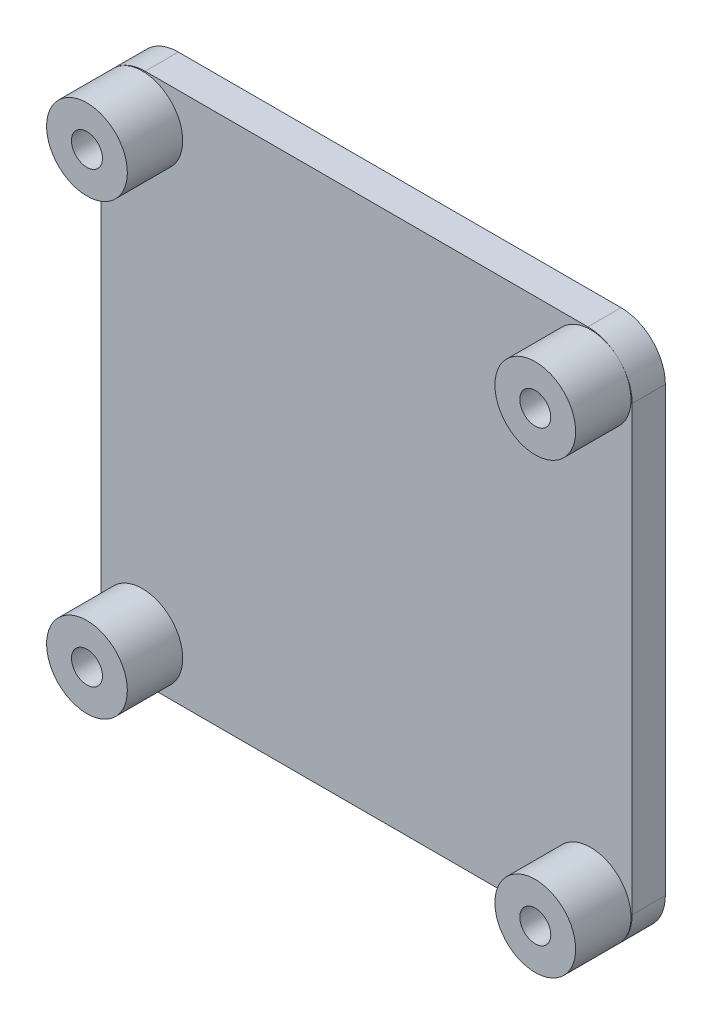
ISO-10303-21;
HEADER;
FILE_DESCRIPTION(('STEP AP214'),'2;1');
FILE_NAME('part.step','',(''),(''),'','','');
FILE_SCHEMA(('AUTOMOTIVE_DESIGN { 1 0 10303 214 1 1 1 1 }'));
ENDSEC;
DATA;
#1=APPLICATION_CONTEXT('core data for automotive mechanical design processes');
#2=APPLICATION_PROTOCOL_DEFINITION('international standard','automotive_design',2000,#1);
#3=PRODUCT_CONTEXT('',#1,'mechanical');
#4=PRODUCT('Part','Part','',(#3));
#5=PRODUCT_RELATED_PRODUCT_CATEGORY('part','',(#4));
#6=PRODUCT_DEFINITION_FORMATION('','',#4);
#7=PRODUCT_DEFINITION_CONTEXT('part definition',#1,'design');
#8=PRODUCT_DEFINITION('design','',#6,#7);
#9=PRODUCT_DEFINITION_SHAPE('','',#8);
#10=(LENGTH_UNIT() NAMED_UNIT(*) SI_UNIT(.MILLI.,.METRE.));
#11=(NAMED_UNIT(*) PLANE_ANGLE_UNIT() SI_UNIT($,.RADIAN.));
#12=(NAMED_UNIT(*) SI_UNIT($,.STERADIAN.) SOLID_ANGLE_UNIT());
#13=UNCERTAINTY_MEASURE_WITH_UNIT(LENGTH_MEASURE(1.E-05),#10,'distance_accuracy_value','');
#14=(GEOMETRIC_REPRESENTATION_CONTEXT(3) GLOBAL_UNCERTAINTY_ASSIGNED_CONTEXT((#13)) GLOBAL_UNIT_ASSIGNED_CONTEXT((#10,
#11,#12)) REPRESENTATION_CONTEXT('',''));
#15=CARTESIAN_POINT('',(0.,0.,0.));
#16=DIRECTION('',(0.,0.,1.));
#17=DIRECTION('',(1.,0.,0.));
#18=AXIS2_PLACEMENT_3D('',#15,#16,#17);
#19=CARTESIAN_POINT('',(0.,0.,3.));
#20=DIRECTION('',(0.,0.,1.));
#21=DIRECTION('',(1.,0.,0.));
#22=AXIS2_PLACEMENT_3D('',#19,#20,#21);
#23=PLANE('',#22);
#24=CARTESIAN_POINT('',(-20.,-20.,3.));
#25=DIRECTION('',(0.,0.,1.));
#26=DIRECTION('',(1.,0.,0.));
#27=AXIS2_PLACEMENT_3D('',#24,#25,#26);
#28=CIRCLE('',#27,4.);
#29=CARTESIAN_POINT('',(-24.,-20.,3.));
#30=VERTEX_POINT('',#29);
#31=CARTESIAN_POINT('',(-22.8284271247487,-22.8284271247437,3.));
#32=VERTEX_POINT('',#31);
#33=EDGE_CURVE('E275',#30,#32,#28,.T.);
#34=ORIENTED_EDGE('',*,*,#33,.T.);
#35=CARTESIAN_POINT('',(-20.2500000000002,-20.2499999999998,3.));
#36=DIRECTION('',(0.,0.,1.));
#37=DIRECTION('',(1.,0.,0.));
#38=AXIS2_PLACEMENT_3D('',#35,#36,#37);
#39=CIRCLE('',#38,3.64644660940673);
#40=EDGE_CURVE('E59',#32,#32,#39,.T.);
#41=ORIENTED_EDGE('',*,*,#40,.F.);
#42=CARTESIAN_POINT('',(-20.,-24.,3.));
#43=VERTEX_POINT('',#42);
#44=EDGE_CURVE('E274',#32,#43,#28,.T.);
#45=ORIENTED_EDGE('',*,*,#44,.T.);
#46=DIRECTION('',(1.,0.,0.));
#47=VECTOR('',#46,1.);
#48=CARTESIAN_POINT('',(-24.,-24.,3.));
#49=LINE('',#48,#47);
#50=CARTESIAN_POINT('',(20.,-24.,3.));
#51=VERTEX_POINT('',#50);
#52=EDGE_CURVE('E231',#43,#51,#49,.T.);
#53=ORIENTED_EDGE('',*,*,#52,.T.);
#54=CARTESIAN_POINT('',(20.,-20.,3.));
#55=DIRECTION('',(0.,0.,1.));
#56=DIRECTION('',(1.,0.,0.));
#57=AXIS2_PLACEMENT_3D('',#54,#55,#56);
#58=CIRCLE('',#57,4.);
#59=CARTESIAN_POINT('',(22.8284271247445,-22.8284271247479,3.));
#60=VERTEX_POINT('',#59);
#61=EDGE_CURVE('E148',#51,#60,#58,.T.);
#62=ORIENTED_EDGE('',*,*,#61,.T.);
#63=CARTESIAN_POINT('',(20.2499999999998,-20.2500000000002,3.));
#64=DIRECTION('',(0.,0.,1.));
#65=DIRECTION('',(1.,0.,0.));
#66=AXIS2_PLACEMENT_3D('',#63,#64,#65);
#67=CIRCLE('',#66,3.64644660940673);
#68=EDGE_CURVE('E64',#60,#60,#67,.T.);
#69=ORIENTED_EDGE('',*,*,#68,.F.);
#70=CARTESIAN_POINT('',(24.,-20.,3.));
#71=VERTEX_POINT('',#70);
#72=EDGE_CURVE('E131',#60,#71,#58,.T.);
#73=ORIENTED_EDGE('',*,*,#72,.T.);
#74=DIRECTION('',(0.,1.,0.));
#75=VECTOR('',#74,1.);
#76=CARTESIAN_POINT('',(24.,24.,3.));
#77=LINE('',#76,#75);
#78=CARTESIAN_POINT('',(24.,20.,3.));
#79=VERTEX_POINT('',#78);
#80=EDGE_CURVE('E221',#71,#79,#77,.T.);
#81=ORIENTED_EDGE('',*,*,#80,.T.);
#82=CARTESIAN_POINT('',(20.,20.,3.));
#83=DIRECTION('',(0.,0.,1.));
#84=DIRECTION('',(1.,0.,0.));
#85=AXIS2_PLACEMENT_3D('',#82,#83,#84);
#86=CIRCLE('',#85,4.);
#87=CARTESIAN_POINT('',(22.828427124747,22.8284271247454,3.));
#88=VERTEX_POINT('',#87);
#89=EDGE_CURVE('E141',#79,#88,#86,.T.);
#90=ORIENTED_EDGE('',*,*,#89,.T.);
#91=CARTESIAN_POINT('',(20.2500000000001,20.2499999999999,3.));
#92=DIRECTION('',(0.,0.,1.));
#93=DIRECTION('',(1.,0.,0.));
#94=AXIS2_PLACEMENT_3D('',#91,#92,#93);
#95=CIRCLE('',#94,3.64644660940673);
#96=EDGE_CURVE('E192',#88,#88,#95,.T.);
#97=ORIENTED_EDGE('',*,*,#96,.F.);
#98=CARTESIAN_POINT('',(20.,24.,3.));
#99=VERTEX_POINT('',#98);
#100=EDGE_CURVE('E144',#88,#99,#86,.T.);
#101=ORIENTED_EDGE('',*,*,#100,.T.);
#102=DIRECTION('',(-1.,0.,0.));
#103=VECTOR('',#102,1.);
#104=CARTESIAN_POINT('',(-24.,24.,3.));
#105=LINE('',#104,#103);
#106=CARTESIAN_POINT('',(-20.,24.,3.));
#107=VERTEX_POINT('',#106);
#108=EDGE_CURVE('E127',#99,#107,#105,.T.);
#109=ORIENTED_EDGE('',*,*,#108,.T.);
#110=CARTESIAN_POINT('',(-20.,20.,3.));
#111=DIRECTION('',(0.,0.,1.));
#112=DIRECTION('',(1.,0.,0.));
#113=AXIS2_PLACEMENT_3D('',#110,#111,#112);
#114=CIRCLE('',#113,4.);
#115=CARTESIAN_POINT('',(-22.8284271247461,22.8284271247463,3.));
#116=VERTEX_POINT('',#115);
#117=EDGE_CURVE('E121',#107,#116,#114,.T.);
#118=ORIENTED_EDGE('',*,*,#117,.T.);
#119=CARTESIAN_POINT('',(-20.25,20.25,3.));
#120=DIRECTION('',(0.,0.,1.));
#121=DIRECTION('',(1.,0.,0.));
#122=AXIS2_PLACEMENT_3D('',#119,#120,#121);
#123=CIRCLE('',#122,3.64644660940673);
#124=EDGE_CURVE('E125',#116,#116,#123,.T.);
#125=ORIENTED_EDGE('',*,*,#124,.F.);
#126=CARTESIAN_POINT('',(-24.,20.,3.));
#127=VERTEX_POINT('',#126);
#128=EDGE_CURVE('E132',#116,#127,#114,.T.);
#129=ORIENTED_EDGE('',*,*,#128,.T.);
#130=DIRECTION('',(0.,-1.,0.));
#131=VECTOR('',#130,1.);
#132=CARTESIAN_POINT('',(-24.,24.,3.));
#133=LINE('',#132,#131);
#134=EDGE_CURVE('E228',#127,#30,#133,.T.);
#135=ORIENTED_EDGE('',*,*,#134,.T.);
#136=EDGE_LOOP('',(#34,#41,#45,#53,#62,#69,#73,#81,#90,#97,#101,#109,#118,#125,#129,#135));
#137=FACE_BOUND('',#136,.T.);
#138=ADVANCED_FACE('F43',(#137),#23,.T.);
#139=CARTESIAN_POINT('',(0.,0.,0.));
#140=DIRECTION('',(0.,0.,1.));
#141=DIRECTION('',(1.,0.,0.));
#142=AXIS2_PLACEMENT_3D('',#139,#140,#141);
#143=PLANE('',#142);
#144=DIRECTION('',(0.,1.,0.));
#145=VECTOR('',#144,1.);
#146=CARTESIAN_POINT('',(24.,24.,0.));
#147=LINE('',#146,#145);
#148=CARTESIAN_POINT('',(24.,-20.,0.));
#149=VERTEX_POINT('',#148);
#150=CARTESIAN_POINT('',(24.,20.,0.));
#151=VERTEX_POINT('',#150);
#152=EDGE_CURVE('E220',#149,#151,#147,.T.);
#153=ORIENTED_EDGE('',*,*,#152,.F.);
#154=CARTESIAN_POINT('',(20.,-20.,0.));
#155=DIRECTION('',(0.,0.,1.));
#156=DIRECTION('',(1.,0.,0.));
#157=AXIS2_PLACEMENT_3D('',#154,#155,#156);
#158=CIRCLE('',#157,4.);
#159=CARTESIAN_POINT('',(20.,-24.,0.));
#160=VERTEX_POINT('',#159);
#161=EDGE_CURVE('E265',#149,#160,#158,.F.);
#162=ORIENTED_EDGE('',*,*,#161,.T.);
#163=DIRECTION('',(1.,0.,0.));
#164=VECTOR('',#163,1.);
#165=CARTESIAN_POINT('',(-24.,-24.,0.));
#166=LINE('',#165,#164);
#167=CARTESIAN_POINT('',(-20.,-24.,0.));
#168=VERTEX_POINT('',#167);
#169=EDGE_CURVE('E225',#168,#160,#166,.T.);
#170=ORIENTED_EDGE('',*,*,#169,.F.);
#171=CARTESIAN_POINT('',(-20.,-20.,0.));
#172=DIRECTION('',(0.,0.,1.));
#173=DIRECTION('',(1.,0.,0.));
#174=AXIS2_PLACEMENT_3D('',#171,#172,#173);
#175=CIRCLE('',#174,4.);
#176=CARTESIAN_POINT('',(-24.,-20.,0.));
#177=VERTEX_POINT('',#176);
#178=EDGE_CURVE('E256',#168,#177,#175,.F.);
#179=ORIENTED_EDGE('',*,*,#178,.T.);
#180=DIRECTION('',(0.,-1.,0.));
#181=VECTOR('',#180,1.);
#182=CARTESIAN_POINT('',(-24.,24.,0.));
#183=LINE('',#182,#181);
#184=CARTESIAN_POINT('',(-24.,20.,0.));
#185=VERTEX_POINT('',#184);
#186=EDGE_CURVE('E243',#185,#177,#183,.T.);
#187=ORIENTED_EDGE('',*,*,#186,.F.);
#188=CARTESIAN_POINT('',(-20.,20.,0.));
#189=DIRECTION('',(0.,0.,1.));
#190=DIRECTION('',(1.,0.,0.));
#191=AXIS2_PLACEMENT_3D('',#188,#189,#190);
#192=CIRCLE('',#191,4.);
#193=CARTESIAN_POINT('',(-20.,24.,0.));
#194=VERTEX_POINT('',#193);
#195=EDGE_CURVE('E262',#185,#194,#192,.F.);
#196=ORIENTED_EDGE('',*,*,#195,.T.);
#197=DIRECTION('',(-1.,0.,0.));
#198=VECTOR('',#197,1.);
#199=CARTESIAN_POINT('',(-24.,24.,0.));
#200=LINE('',#199,#198);
#201=CARTESIAN_POINT('',(20.,24.,0.));
#202=VERTEX_POINT('',#201);
#203=EDGE_CURVE('E239',#202,#194,#200,.T.);
#204=ORIENTED_EDGE('',*,*,#203,.F.);
#205=CARTESIAN_POINT('',(20.,20.,0.));
#206=DIRECTION('',(0.,0.,1.));
#207=DIRECTION('',(1.,0.,0.));
#208=AXIS2_PLACEMENT_3D('',#205,#206,#207);
#209=CIRCLE('',#208,4.);
#210=EDGE_CURVE('E259',#202,#151,#209,.F.);
#211=ORIENTED_EDGE('',*,*,#210,.T.);
#212=EDGE_LOOP('',(#153,#162,#170,#179,#187,#196,#204,#211));
#213=FACE_BOUND('',#212,.T.);
#214=CARTESIAN_POINT('',(-20.25,20.25,0.));
#215=DIRECTION('',(0.,0.,1.));
#216=DIRECTION('',(1.,0.,0.));
#217=AXIS2_PLACEMENT_3D('',#214,#215,#216);
#218=CIRCLE('',#217,1.4);
#219=CARTESIAN_POINT('',(-18.85,20.25,0.));
#220=VERTEX_POINT('',#219);
#221=EDGE_CURVE('E216',#220,#220,#218,.T.);
#222=ORIENTED_EDGE('',*,*,#221,.T.);
#223=EDGE_LOOP('',(#222));
#224=FACE_BOUND('',#223,.T.);
#225=CARTESIAN_POINT('',(20.2499999999998,20.2499999999998,0.));
#226=DIRECTION('',(0.,0.,1.));
#227=DIRECTION('',(1.,0.,0.));
#228=AXIS2_PLACEMENT_3D('',#225,#226,#227);
#229=CIRCLE('',#228,1.4);
#230=CARTESIAN_POINT('',(21.6499999999998,20.2499999999998,0.));
#231=VERTEX_POINT('',#230);
#232=EDGE_CURVE('E212',#231,#231,#229,.T.);
#233=ORIENTED_EDGE('',*,*,#232,.T.);
#234=EDGE_LOOP('',(#233));
#235=FACE_BOUND('',#234,.T.);
#236=CARTESIAN_POINT('',(20.2499999999996,-20.25,0.));
#237=DIRECTION('',(0.,0.,1.));
#238=DIRECTION('',(1.,0.,0.));
#239=AXIS2_PLACEMENT_3D('',#236,#237,#238);
#240=CIRCLE('',#239,1.4);
#241=CARTESIAN_POINT('',(21.6499999999996,-20.25,0.));
#242=VERTEX_POINT('',#241);
#243=EDGE_CURVE('E208',#242,#242,#240,.T.);
#244=ORIENTED_EDGE('',*,*,#243,.T.);
#245=EDGE_LOOP('',(#244));
#246=FACE_BOUND('',#245,.T.);
#247=CARTESIAN_POINT('',(-20.2500000000002,-20.2499999999998,0.));
#248=DIRECTION('',(0.,0.,1.));
#249=DIRECTION('',(1.,0.,0.));
#250=AXIS2_PLACEMENT_3D('',#247,#248,#249);
#251=CIRCLE('',#250,1.4);
#252=CARTESIAN_POINT('',(-18.8500000000002,-20.2499999999998,0.));
#253=VERTEX_POINT('',#252);
#254=EDGE_CURVE('E202',#253,#253,#251,.T.);
#255=ORIENTED_EDGE('',*,*,#254,.T.);
#256=EDGE_LOOP('',(#255));
#257=FACE_BOUND('',#256,.T.);
#258=ADVANCED_FACE('F293',(#213,#224,#235,#246,#257),#143,.F.);
#259=CARTESIAN_POINT('',(24.,24.,3.));
#260=DIRECTION('',(-1.,0.,0.));
#261=DIRECTION('',(0.,-1.,0.));
#262=AXIS2_PLACEMENT_3D('',#259,#260,#261);
#263=PLANE('',#262);
#264=ORIENTED_EDGE('',*,*,#80,.F.);
#265=DIRECTION('',(0.,0.,-1.));
#266=VECTOR('',#265,1.);
#267=CARTESIAN_POINT('',(24.,-20.,3.));
#268=LINE('',#267,#266);
#269=EDGE_CURVE('E252',#71,#149,#268,.T.);
#270=ORIENTED_EDGE('',*,*,#269,.T.);
#271=ORIENTED_EDGE('',*,*,#152,.T.);
#272=DIRECTION('',(0.,0.,-1.));
#273=VECTOR('',#272,1.);
#274=CARTESIAN_POINT('',(24.,20.,3.));
#275=LINE('',#274,#273);
#276=EDGE_CURVE('E235',#151,#79,#275,.F.);
#277=ORIENTED_EDGE('',*,*,#276,.T.);
#278=EDGE_LOOP('',(#264,#270,#271,#277));
#279=FACE_BOUND('',#278,.T.);
#280=ADVANCED_FACE('F306',(#279),#263,.F.);
#281=CARTESIAN_POINT('',(-24.,24.,3.));
#282=DIRECTION('',(0.,-1.,0.));
#283=DIRECTION('',(0.,0.,-1.));
#284=AXIS2_PLACEMENT_3D('',#281,#282,#283);
#285=PLANE('',#284);
#286=ORIENTED_EDGE('',*,*,#203,.T.);
#287=DIRECTION('',(0.,0.,-1.));
#288=VECTOR('',#287,1.);
#289=CARTESIAN_POINT('',(-20.,24.,3.));
#290=LINE('',#289,#288);
#291=EDGE_CURVE('E11',#194,#107,#290,.F.);
#292=ORIENTED_EDGE('',*,*,#291,.T.);
#293=ORIENTED_EDGE('',*,*,#108,.F.);
#294=DIRECTION('',(0.,0.,-1.));
#295=VECTOR('',#294,1.);
#296=CARTESIAN_POINT('',(20.,24.,3.));
#297=LINE('',#296,#295);
#298=EDGE_CURVE('E53',#99,#202,#297,.T.);
#299=ORIENTED_EDGE('',*,*,#298,.T.);
#300=EDGE_LOOP('',(#286,#292,#293,#299));
#301=FACE_BOUND('',#300,.T.);
#302=ADVANCED_FACE('F298',(#301),#285,.F.);
#303=CARTESIAN_POINT('',(-24.,24.,3.));
#304=DIRECTION('',(1.,0.,0.));
#305=DIRECTION('',(0.,1.,0.));
#306=AXIS2_PLACEMENT_3D('',#303,#304,#305);
#307=PLANE('',#306);
#308=ORIENTED_EDGE('',*,*,#134,.F.);
#309=DIRECTION('',(0.,0.,-1.));
#310=VECTOR('',#309,1.);
#311=CARTESIAN_POINT('',(-24.,20.,3.));
#312=LINE('',#311,#310);
#313=EDGE_CURVE('E137',#127,#185,#312,.T.);
#314=ORIENTED_EDGE('',*,*,#313,.T.);
#315=ORIENTED_EDGE('',*,*,#186,.T.);
#316=DIRECTION('',(0.,0.,-1.));
#317=VECTOR('',#316,1.);
#318=CARTESIAN_POINT('',(-24.,-20.,3.));
#319=LINE('',#318,#317);
#320=EDGE_CURVE('E152',#177,#30,#319,.F.);
#321=ORIENTED_EDGE('',*,*,#320,.T.);
#322=EDGE_LOOP('',(#308,#314,#315,#321));
#323=FACE_BOUND('',#322,.T.);
#324=ADVANCED_FACE('F296',(#323),#307,.F.);
#325=CARTESIAN_POINT('',(-24.,-24.,3.));
#326=DIRECTION('',(0.,1.,0.));
#327=DIRECTION('',(0.,0.,1.));
#328=AXIS2_PLACEMENT_3D('',#325,#326,#327);
#329=PLANE('',#328);
#330=ORIENTED_EDGE('',*,*,#169,.T.);
#331=DIRECTION('',(0.,0.,-1.));
#332=VECTOR('',#331,1.);
#333=CARTESIAN_POINT('',(20.,-24.,3.));
#334=LINE('',#333,#332);
#335=EDGE_CURVE('E272',#160,#51,#334,.F.);
#336=ORIENTED_EDGE('',*,*,#335,.T.);
#337=ORIENTED_EDGE('',*,*,#52,.F.);
#338=DIRECTION('',(0.,0.,-1.));
#339=VECTOR('',#338,1.);
#340=CARTESIAN_POINT('',(-20.,-24.,3.));
#341=LINE('',#340,#339);
#342=EDGE_CURVE('E268',#43,#168,#341,.T.);
#343=ORIENTED_EDGE('',*,*,#342,.T.);
#344=EDGE_LOOP('',(#330,#336,#337,#343));
#345=FACE_BOUND('',#344,.T.);
#346=ADVANCED_FACE('F286',(#345),#329,.F.);
#347=CARTESIAN_POINT('',(-20.25,20.25,3.));
#348=DIRECTION('',(0.,0.,-1.));
#349=DIRECTION('',(-1.,0.,0.));
#350=AXIS2_PLACEMENT_3D('',#347,#348,#349);
#351=CYLINDRICAL_SURFACE('',#350,1.4);
#352=ORIENTED_EDGE('',*,*,#221,.F.);
#353=EDGE_LOOP('',(#352));
#354=FACE_BOUND('',#353,.T.);
#355=CARTESIAN_POINT('',(-20.2499999999999,20.2499999999997,8.00000000000001));
#356=DIRECTION('',(0.,0.,1.));
#357=DIRECTION('',(1.,0.,0.));
#358=AXIS2_PLACEMENT_3D('',#355,#356,#357);
#359=CIRCLE('',#358,1.40000000000001);
#360=CARTESIAN_POINT('',(-18.8499999999999,20.2499999999997,8.00000000000001));
#361=VERTEX_POINT('',#360);
#362=EDGE_CURVE('E170',#361,#361,#359,.T.);
#363=ORIENTED_EDGE('',*,*,#362,.T.);
#364=EDGE_LOOP('',(#363));
#365=FACE_BOUND('',#364,.T.);
#366=ADVANCED_FACE('F304',(#354,#365),#351,.F.);
#367=CARTESIAN_POINT('',(20.2499999999998,20.2499999999998,3.));
#368=DIRECTION('',(0.,0.,-1.));
#369=DIRECTION('',(-1.,0.,0.));
#370=AXIS2_PLACEMENT_3D('',#367,#368,#369);
#371=CYLINDRICAL_SURFACE('',#370,1.4);
#372=ORIENTED_EDGE('',*,*,#232,.F.);
#373=EDGE_LOOP('',(#372));
#374=FACE_BOUND('',#373,.T.);
#375=CARTESIAN_POINT('',(20.2499999999998,20.2499999999998,8.00000000000001));
#376=DIRECTION('',(0.,0.,1.));
#377=DIRECTION('',(1.,0.,0.));
#378=AXIS2_PLACEMENT_3D('',#375,#376,#377);
#379=CIRCLE('',#378,1.4);
#380=CARTESIAN_POINT('',(21.6499999999998,20.2499999999998,8.00000000000001));
#381=VERTEX_POINT('',#380);
#382=EDGE_CURVE('E47',#381,#381,#379,.T.);
#383=ORIENTED_EDGE('',*,*,#382,.T.);
#384=EDGE_LOOP('',(#383));
#385=FACE_BOUND('',#384,.T.);
#386=ADVANCED_FACE('F318',(#374,#385),#371,.F.);
#387=CARTESIAN_POINT('',(20.2499999999996,-20.25,3.));
#388=DIRECTION('',(0.,0.,-1.));
#389=DIRECTION('',(-1.,0.,0.));
#390=AXIS2_PLACEMENT_3D('',#387,#388,#389);
#391=CYLINDRICAL_SURFACE('',#390,1.4);
#392=ORIENTED_EDGE('',*,*,#243,.F.);
#393=EDGE_LOOP('',(#392));
#394=FACE_BOUND('',#393,.T.);
#395=CARTESIAN_POINT('',(20.25,-20.2499999999996,8.00000000000001));
#396=DIRECTION('',(0.,0.,1.));
#397=DIRECTION('',(1.,0.,0.));
#398=AXIS2_PLACEMENT_3D('',#395,#396,#397);
#399=CIRCLE('',#398,1.4);
#400=CARTESIAN_POINT('',(21.65,-20.2499999999996,8.00000000000001));
#401=VERTEX_POINT('',#400);
#402=EDGE_CURVE('E163',#401,#401,#399,.T.);
#403=ORIENTED_EDGE('',*,*,#402,.T.);
#404=EDGE_LOOP('',(#403));
#405=FACE_BOUND('',#404,.T.);
#406=ADVANCED_FACE('F322',(#394,#405),#391,.F.);
#407=CARTESIAN_POINT('',(-20.2500000000002,-20.2499999999998,3.));
#408=DIRECTION('',(0.,0.,-1.));
#409=DIRECTION('',(-1.,0.,0.));
#410=AXIS2_PLACEMENT_3D('',#407,#408,#409);
#411=CYLINDRICAL_SURFACE('',#410,1.4);
#412=ORIENTED_EDGE('',*,*,#254,.F.);
#413=EDGE_LOOP('',(#412));
#414=FACE_BOUND('',#413,.T.);
#415=CARTESIAN_POINT('',(-20.2499999999997,-20.25,8.00000000000001));
#416=DIRECTION('',(0.,0.,1.));
#417=DIRECTION('',(1.,0.,0.));
#418=AXIS2_PLACEMENT_3D('',#415,#416,#417);
#419=CIRCLE('',#418,1.4);
#420=CARTESIAN_POINT('',(-18.8499999999997,-20.25,8.00000000000001));
#421=VERTEX_POINT('',#420);
#422=EDGE_CURVE('E160',#421,#421,#419,.T.);
#423=ORIENTED_EDGE('',*,*,#422,.T.);
#424=EDGE_LOOP('',(#423));
#425=FACE_BOUND('',#424,.T.);
#426=ADVANCED_FACE('F326',(#414,#425),#411,.F.);
#427=CARTESIAN_POINT('',(20.,-20.,3.));
#428=DIRECTION('',(0.,0.,-1.));
#429=DIRECTION('',(-1.,0.,0.));
#430=AXIS2_PLACEMENT_3D('',#427,#428,#429);
#431=CYLINDRICAL_SURFACE('',#430,4.);
#432=ORIENTED_EDGE('',*,*,#61,.F.);
#433=ORIENTED_EDGE('',*,*,#335,.F.);
#434=ORIENTED_EDGE('',*,*,#161,.F.);
#435=ORIENTED_EDGE('',*,*,#269,.F.);
#436=ORIENTED_EDGE('',*,*,#72,.F.);
#437=EDGE_LOOP('',(#432,#433,#434,#435,#436));
#438=FACE_BOUND('',#437,.T.);
#439=ADVANCED_FACE('F330',(#438),#431,.T.);
#440=CARTESIAN_POINT('',(-20.,20.,3.));
#441=DIRECTION('',(0.,0.,-1.));
#442=DIRECTION('',(-1.,0.,0.));
#443=AXIS2_PLACEMENT_3D('',#440,#441,#442);
#444=CYLINDRICAL_SURFACE('',#443,4.);
#445=ORIENTED_EDGE('',*,*,#117,.F.);
#446=ORIENTED_EDGE('',*,*,#291,.F.);
#447=ORIENTED_EDGE('',*,*,#195,.F.);
#448=ORIENTED_EDGE('',*,*,#313,.F.);
#449=ORIENTED_EDGE('',*,*,#128,.F.);
#450=EDGE_LOOP('',(#445,#446,#447,#448,#449));
#451=FACE_BOUND('',#450,.T.);
#452=ADVANCED_FACE('F135',(#451),#444,.T.);
#453=CARTESIAN_POINT('',(20.,20.,3.));
#454=DIRECTION('',(0.,0.,-1.));
#455=DIRECTION('',(-1.,0.,0.));
#456=AXIS2_PLACEMENT_3D('',#453,#454,#455);
#457=CYLINDRICAL_SURFACE('',#456,4.);
#458=ORIENTED_EDGE('',*,*,#89,.F.);
#459=ORIENTED_EDGE('',*,*,#276,.F.);
#460=ORIENTED_EDGE('',*,*,#210,.F.);
#461=ORIENTED_EDGE('',*,*,#298,.F.);
#462=ORIENTED_EDGE('',*,*,#100,.F.);
#463=EDGE_LOOP('',(#458,#459,#460,#461,#462));
#464=FACE_BOUND('',#463,.T.);
#465=ADVANCED_FACE('F462',(#464),#457,.T.);
#466=CARTESIAN_POINT('',(-20.,-20.,3.));
#467=DIRECTION('',(0.,0.,-1.));
#468=DIRECTION('',(-1.,0.,0.));
#469=AXIS2_PLACEMENT_3D('',#466,#467,#468);
#470=CYLINDRICAL_SURFACE('',#469,4.);
#471=ORIENTED_EDGE('',*,*,#33,.F.);
#472=ORIENTED_EDGE('',*,*,#320,.F.);
#473=ORIENTED_EDGE('',*,*,#178,.F.);
#474=ORIENTED_EDGE('',*,*,#342,.F.);
#475=ORIENTED_EDGE('',*,*,#44,.F.);
#476=EDGE_LOOP('',(#471,#472,#473,#474,#475));
#477=FACE_BOUND('',#476,.T.);
#478=ADVANCED_FACE('F45',(#477),#470,.T.);
#479=CARTESIAN_POINT('',(-20.25,20.25,8.));
#480=DIRECTION('',(0.,0.,1.));
#481=DIRECTION('',(1.,0.,0.));
#482=AXIS2_PLACEMENT_3D('',#479,#480,#481);
#483=PLANE('',#482);
#484=ORIENTED_EDGE('',*,*,#362,.F.);
#485=EDGE_LOOP('',(#484));
#486=FACE_BOUND('',#485,.T.);
#487=CARTESIAN_POINT('',(-20.25,20.25,8.));
#488=DIRECTION('',(0.,0.,1.));
#489=DIRECTION('',(1.,0.,0.));
#490=AXIS2_PLACEMENT_3D('',#487,#488,#489);
#491=CIRCLE('',#490,3.64644660940673);
#492=CARTESIAN_POINT('',(-16.6035533905933,20.25,8.));
#493=VERTEX_POINT('',#492);
#494=EDGE_CURVE('E198',#493,#493,#491,.T.);
#495=ORIENTED_EDGE('',*,*,#494,.T.);
#496=EDGE_LOOP('',(#495));
#497=FACE_BOUND('',#496,.T.);
#498=ADVANCED_FACE('F336',(#486,#497),#483,.T.);
#499=CARTESIAN_POINT('',(-20.25,20.25,8.));
#500=DIRECTION('',(0.,0.,-1.));
#501=DIRECTION('',(-1.,0.,0.));
#502=AXIS2_PLACEMENT_3D('',#499,#500,#501);
#503=CYLINDRICAL_SURFACE('',#502,3.64644660940673);
#504=ORIENTED_EDGE('',*,*,#494,.F.);
#505=EDGE_LOOP('',(#504));
#506=FACE_BOUND('',#505,.T.);
#507=ORIENTED_EDGE('',*,*,#124,.T.);
#508=EDGE_LOOP('',(#507));
#509=FACE_BOUND('',#508,.T.);
#510=ADVANCED_FACE('F332',(#506,#509),#503,.T.);
#511=CARTESIAN_POINT('',(20.2500000000001,20.2499999999999,8.));
#512=DIRECTION('',(0.,0.,-1.));
#513=DIRECTION('',(-1.,0.,0.));
#514=AXIS2_PLACEMENT_3D('',#511,#512,#513);
#515=CYLINDRICAL_SURFACE('',#514,3.64644660940673);
#516=CARTESIAN_POINT('',(20.2500000000001,20.2499999999999,8.));
#517=DIRECTION('',(0.,0.,1.));
#518=DIRECTION('',(1.,0.,0.));
#519=AXIS2_PLACEMENT_3D('',#516,#517,#518);
#520=CIRCLE('',#519,3.64644660940673);
#521=CARTESIAN_POINT('',(23.8964466094068,20.2499999999999,8.));
#522=VERTEX_POINT('',#521);
#523=EDGE_CURVE('E188',#522,#522,#520,.T.);
#524=ORIENTED_EDGE('',*,*,#523,.F.);
#525=EDGE_LOOP('',(#524));
#526=FACE_BOUND('',#525,.T.);
#527=ORIENTED_EDGE('',*,*,#96,.T.);
#528=EDGE_LOOP('',(#527));
#529=FACE_BOUND('',#528,.T.);
#530=ADVANCED_FACE('F335',(#526,#529),#515,.T.);
#531=CARTESIAN_POINT('',(20.2500000000001,20.2499999999999,8.));
#532=DIRECTION('',(0.,0.,1.));
#533=DIRECTION('',(1.,0.,0.));
#534=AXIS2_PLACEMENT_3D('',#531,#532,#533);
#535=PLANE('',#534);
#536=ORIENTED_EDGE('',*,*,#382,.F.);
#537=EDGE_LOOP('',(#536));
#538=FACE_BOUND('',#537,.T.);
#539=ORIENTED_EDGE('',*,*,#523,.T.);
#540=EDGE_LOOP('',(#539));
#541=FACE_BOUND('',#540,.T.);
#542=ADVANCED_FACE('F341',(#538,#541),#535,.T.);
#543=CARTESIAN_POINT('',(20.2499999999998,-20.2500000000002,8.));
#544=DIRECTION('',(0.,0.,-1.));
#545=DIRECTION('',(-1.,0.,0.));
#546=AXIS2_PLACEMENT_3D('',#543,#544,#545);
#547=CYLINDRICAL_SURFACE('',#546,3.64644660940673);
#548=CARTESIAN_POINT('',(20.2499999999998,-20.2500000000002,8.));
#549=DIRECTION('',(0.,0.,1.));
#550=DIRECTION('',(1.,0.,0.));
#551=AXIS2_PLACEMENT_3D('',#548,#549,#550);
#552=CIRCLE('',#551,3.64644660940673);
#553=CARTESIAN_POINT('',(23.8964466094066,-20.2500000000002,8.));
#554=VERTEX_POINT('',#553);
#555=EDGE_CURVE('E184',#554,#554,#552,.T.);
#556=ORIENTED_EDGE('',*,*,#555,.F.);
#557=EDGE_LOOP('',(#556));
#558=FACE_BOUND('',#557,.T.);
#559=ORIENTED_EDGE('',*,*,#68,.T.);
#560=EDGE_LOOP('',(#559));
#561=FACE_BOUND('',#560,.T.);
#562=ADVANCED_FACE('F344',(#558,#561),#547,.T.);
#563=CARTESIAN_POINT('',(20.2499999999998,-20.2500000000002,8.));
#564=DIRECTION('',(0.,0.,1.));
#565=DIRECTION('',(1.,0.,0.));
#566=AXIS2_PLACEMENT_3D('',#563,#564,#565);
#567=PLANE('',#566);
#568=ORIENTED_EDGE('',*,*,#402,.F.);
#569=EDGE_LOOP('',(#568));
#570=FACE_BOUND('',#569,.T.);
#571=ORIENTED_EDGE('',*,*,#555,.T.);
#572=EDGE_LOOP('',(#571));
#573=FACE_BOUND('',#572,.T.);
#574=ADVANCED_FACE('F349',(#570,#573),#567,.T.);
#575=CARTESIAN_POINT('',(-20.2500000000002,-20.2499999999998,8.));
#576=DIRECTION('',(0.,0.,-1.));
#577=DIRECTION('',(-1.,0.,0.));
#578=AXIS2_PLACEMENT_3D('',#575,#576,#577);
#579=CYLINDRICAL_SURFACE('',#578,3.64644660940673);
#580=CARTESIAN_POINT('',(-20.2500000000002,-20.2499999999998,8.));
#581=DIRECTION('',(0.,0.,1.));
#582=DIRECTION('',(1.,0.,0.));
#583=AXIS2_PLACEMENT_3D('',#580,#581,#582);
#584=CIRCLE('',#583,3.64644660940673);
#585=CARTESIAN_POINT('',(-16.6035533905935,-20.2499999999998,8.));
#586=VERTEX_POINT('',#585);
#587=EDGE_CURVE('E175',#586,#586,#584,.T.);
#588=ORIENTED_EDGE('',*,*,#587,.F.);
#589=EDGE_LOOP('',(#588));
#590=FACE_BOUND('',#589,.T.);
#591=ORIENTED_EDGE('',*,*,#40,.T.);
#592=EDGE_LOOP('',(#591));
#593=FACE_BOUND('',#592,.T.);
#594=ADVANCED_FACE('F352',(#590,#593),#579,.T.);
#595=CARTESIAN_POINT('',(-20.2500000000002,-20.2499999999998,8.));
#596=DIRECTION('',(0.,0.,1.));
#597=DIRECTION('',(1.,0.,0.));
#598=AXIS2_PLACEMENT_3D('',#595,#596,#597);
#599=PLANE('',#598);
#600=ORIENTED_EDGE('',*,*,#422,.F.);
#601=EDGE_LOOP('',(#600));
#602=FACE_BOUND('',#601,.T.);
#603=ORIENTED_EDGE('',*,*,#587,.T.);
#604=EDGE_LOOP('',(#603));
#605=FACE_BOUND('',#604,.T.);
#606=ADVANCED_FACE('F357',(#602,#605),#599,.T.);
#607=CLOSED_SHELL('',(#138,#258,#280,#302,#324,#346,#366,#386,#406,#426,#439,#452,#465,#478,
#498,#510,#530,#542,#562,#574,#594,#606));
#608=MANIFOLD_SOLID_BREP('B2',#607);
#609=ADVANCED_BREP_SHAPE_REPRESENTATION('',(#18,#608),#14);
#610=SHAPE_DEFINITION_REPRESENTATION(#9,#609);
ENDSEC;
END-ISO-10303-21;
